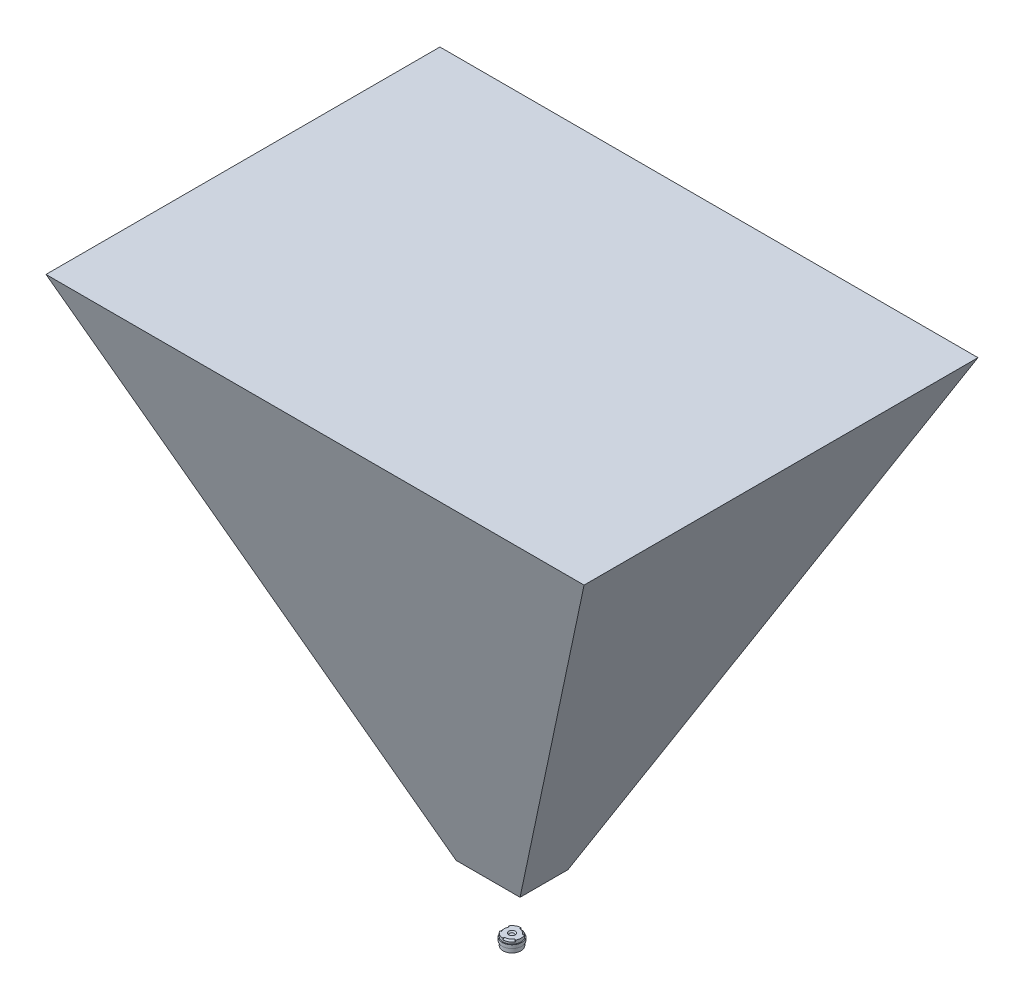
ISO-10303-21;
HEADER;
FILE_DESCRIPTION(('STEP AP214'),'2;1');
FILE_NAME('part.step','',(''),(''),'','','');
FILE_SCHEMA(('AUTOMOTIVE_DESIGN { 1 0 10303 214 1 1 1 1 }'));
ENDSEC;
DATA;
#1=APPLICATION_CONTEXT('core data for automotive mechanical design processes');
#2=APPLICATION_PROTOCOL_DEFINITION('international standard','automotive_design',2000,#1);
#3=PRODUCT_CONTEXT('',#1,'mechanical');
#4=PRODUCT('Part','Part','',(#3));
#5=PRODUCT_RELATED_PRODUCT_CATEGORY('part','',(#4));
#6=PRODUCT_DEFINITION_FORMATION('','',#4);
#7=PRODUCT_DEFINITION_CONTEXT('part definition',#1,'design');
#8=PRODUCT_DEFINITION('design','',#6,#7);
#9=PRODUCT_DEFINITION_SHAPE('','',#8);
#10=(LENGTH_UNIT() NAMED_UNIT(*) SI_UNIT(.MILLI.,.METRE.));
#11=(NAMED_UNIT(*) PLANE_ANGLE_UNIT() SI_UNIT($,.RADIAN.));
#12=(NAMED_UNIT(*) SI_UNIT($,.STERADIAN.) SOLID_ANGLE_UNIT());
#13=UNCERTAINTY_MEASURE_WITH_UNIT(LENGTH_MEASURE(1.E-05),#10,'distance_accuracy_value','');
#14=(GEOMETRIC_REPRESENTATION_CONTEXT(3) GLOBAL_UNCERTAINTY_ASSIGNED_CONTEXT((#13)) GLOBAL_UNIT_ASSIGNED_CONTEXT((#10,
#11,#12)) REPRESENTATION_CONTEXT('',''));
#15=CARTESIAN_POINT('',(0.,0.,0.));
#16=DIRECTION('',(0.,0.,1.));
#17=DIRECTION('',(1.,0.,0.));
#18=AXIS2_PLACEMENT_3D('',#15,#16,#17);
#19=CARTESIAN_POINT('',(100.,163.556471780119,60.));
#20=DIRECTION('',(0.,-1.,0.));
#21=DIRECTION('',(0.,0.,-1.));
#22=AXIS2_PLACEMENT_3D('',#19,#20,#21);
#23=PLANE('',#22);
#24=DIRECTION('',(0.,0.,1.));
#25=VECTOR('',#24,1.);
#26=CARTESIAN_POINT('',(-81.9593515242549,163.556471780119,-60.));
#27=LINE('',#26,#25);
#28=CARTESIAN_POINT('',(-81.9593515242549,163.556471780119,-60.));
#29=VERTEX_POINT('',#28);
#30=CARTESIAN_POINT('',(-81.9593515242549,163.556471780119,60.));
#31=VERTEX_POINT('',#30);
#32=EDGE_CURVE('E69',#29,#31,#27,.T.);
#33=ORIENTED_EDGE('',*,*,#32,.T.);
#34=DIRECTION('',(-1.,0.,0.));
#35=VECTOR('',#34,1.);
#36=CARTESIAN_POINT('',(100.,163.556471780119,60.));
#37=LINE('',#36,#35);
#38=CARTESIAN_POINT('',(81.9593515242549,163.556471780119,60.));
#39=VERTEX_POINT('',#38);
#40=EDGE_CURVE('E99',#39,#31,#37,.T.);
#41=ORIENTED_EDGE('',*,*,#40,.F.);
#42=DIRECTION('',(0.,0.,1.));
#43=VECTOR('',#42,1.);
#44=CARTESIAN_POINT('',(81.9593515242549,163.556471780119,-60.));
#45=LINE('',#44,#43);
#46=CARTESIAN_POINT('',(81.9593515242549,163.556471780119,-60.));
#47=VERTEX_POINT('',#46);
#48=EDGE_CURVE('E85',#47,#39,#45,.T.);
#49=ORIENTED_EDGE('',*,*,#48,.F.);
#50=DIRECTION('',(-1.,0.,0.));
#51=VECTOR('',#50,1.);
#52=CARTESIAN_POINT('',(100.,163.556471780119,-60.));
#53=LINE('',#52,#51);
#54=EDGE_CURVE('E111',#47,#29,#53,.T.);
#55=ORIENTED_EDGE('',*,*,#54,.T.);
#56=EDGE_LOOP('',(#33,#41,#49,#55));
#57=FACE_BOUND('',#56,.T.);
#58=ADVANCED_FACE('F48',(#57),#23,.F.);
#59=CARTESIAN_POINT('',(100.,18.7078266128409,7.27940468532404));
#60=DIRECTION('',(0.,0.342020143325668,-0.939692620785909));
#61=DIRECTION('',(0.,0.939692620785909,0.342020143325668));
#62=AXIS2_PLACEMENT_3D('',#59,#60,#61);
#63=PLANE('',#62);
#64=DIRECTION('',(-0.424258256279284,0.850930418263275,0.309713343679521));
#65=VECTOR('',#64,1.);
#66=CARTESIAN_POINT('',(10.0122642665054,-20.9100514633612,-7.14032367920101));
#67=LINE('',#66,#65);
#68=CARTESIAN_POINT('',(-9.7404810923923,18.7078266128409,7.27940468532404));
#69=VERTEX_POINT('',#68);
#70=EDGE_CURVE('E102',#69,#31,#67,.T.);
#71=ORIENTED_EDGE('',*,*,#70,.F.);
#72=DIRECTION('',(-1.,0.,0.));
#73=VECTOR('',#72,1.);
#74=CARTESIAN_POINT('',(100.,18.7078266128409,7.27940468532404));
#75=LINE('',#74,#73);
#76=CARTESIAN_POINT('',(9.7404810923923,18.7078266128409,7.27940468532404));
#77=VERTEX_POINT('',#76);
#78=EDGE_CURVE('E101',#77,#69,#75,.T.);
#79=ORIENTED_EDGE('',*,*,#78,.F.);
#80=DIRECTION('',(-0.424258256279284,-0.850930418263275,-0.309713343679521));
#81=VECTOR('',#80,1.);
#82=CARTESIAN_POINT('',(25.9867493377225,51.2927996301147,19.139364947979));
#83=LINE('',#82,#81);
#84=EDGE_CURVE('E88',#39,#77,#83,.T.);
#85=ORIENTED_EDGE('',*,*,#84,.F.);
#86=ORIENTED_EDGE('',*,*,#40,.T.);
#87=EDGE_LOOP('',(#71,#79,#85,#86));
#88=FACE_BOUND('',#87,.T.);
#89=ADVANCED_FACE('F98',(#88),#63,.F.);
#90=CARTESIAN_POINT('',(100.,18.7078266128409,7.27940468532404));
#91=DIRECTION('',(0.,1.,0.));
#92=DIRECTION('',(0.,0.,1.));
#93=AXIS2_PLACEMENT_3D('',#90,#91,#92);
#94=PLANE('',#93);
#95=DIRECTION('',(0.,0.,1.));
#96=VECTOR('',#95,1.);
#97=CARTESIAN_POINT('',(-9.7404810923923,18.7078266128409,-60.));
#98=LINE('',#97,#96);
#99=CARTESIAN_POINT('',(-9.7404810923923,18.7078266128408,-7.27940468532402));
#100=VERTEX_POINT('',#99);
#101=EDGE_CURVE('E103',#100,#69,#98,.T.);
#102=ORIENTED_EDGE('',*,*,#101,.F.);
#103=DIRECTION('',(-1.,0.,0.));
#104=VECTOR('',#103,1.);
#105=CARTESIAN_POINT('',(100.,18.7078266128409,-7.27940468532404));
#106=LINE('',#105,#104);
#107=CARTESIAN_POINT('',(9.74048109239231,18.7078266128409,-7.27940468532404));
#108=VERTEX_POINT('',#107);
#109=EDGE_CURVE('E106',#108,#100,#106,.T.);
#110=ORIENTED_EDGE('',*,*,#109,.F.);
#111=DIRECTION('',(0.,0.,1.));
#112=VECTOR('',#111,1.);
#113=CARTESIAN_POINT('',(9.7404810923923,18.7078266128409,-60.));
#114=LINE('',#113,#112);
#115=EDGE_CURVE('E62',#108,#77,#114,.T.);
#116=ORIENTED_EDGE('',*,*,#115,.T.);
#117=ORIENTED_EDGE('',*,*,#78,.T.);
#118=EDGE_LOOP('',(#102,#110,#116,#117));
#119=FACE_BOUND('',#118,.T.);
#120=ADVANCED_FACE('F120',(#119),#94,.F.);
#121=CARTESIAN_POINT('',(100.,18.7078266128409,-7.27940468532404));
#122=DIRECTION('',(0.,0.342020143325668,0.939692620785909));
#123=DIRECTION('',(0.,-0.939692620785909,0.342020143325668));
#124=AXIS2_PLACEMENT_3D('',#121,#122,#123);
#125=PLANE('',#124);
#126=DIRECTION('',(0.424258256279284,-0.850930418263275,0.309713343679521));
#127=VECTOR('',#126,1.);
#128=CARTESIAN_POINT('',(10.0122642665054,-20.9100514633612,7.14032367920101));
#129=LINE('',#128,#127);
#130=EDGE_CURVE('E13',#29,#100,#129,.T.);
#131=ORIENTED_EDGE('',*,*,#130,.F.);
#132=ORIENTED_EDGE('',*,*,#54,.F.);
#133=DIRECTION('',(0.424258256279284,0.850930418263275,-0.309713343679521));
#134=VECTOR('',#133,1.);
#135=CARTESIAN_POINT('',(25.9867493377225,51.2927996301147,-19.139364947979));
#136=LINE('',#135,#134);
#137=EDGE_CURVE('E55',#108,#47,#136,.T.);
#138=ORIENTED_EDGE('',*,*,#137,.F.);
#139=ORIENTED_EDGE('',*,*,#109,.T.);
#140=EDGE_LOOP('',(#131,#132,#138,#139));
#141=FACE_BOUND('',#140,.T.);
#142=ADVANCED_FACE('F122',(#141),#125,.F.);
#143=CARTESIAN_POINT('',(9.7404810923923,18.7078266128409,-60.));
#144=DIRECTION('',(0.894934361602024,-0.44619781310981,0.));
#145=DIRECTION('',(0.44619781310981,0.894934361602024,0.));
#146=AXIS2_PLACEMENT_3D('',#143,#144,#145);
#147=PLANE('',#146);
#148=ORIENTED_EDGE('',*,*,#84,.T.);
#149=ORIENTED_EDGE('',*,*,#115,.F.);
#150=ORIENTED_EDGE('',*,*,#137,.T.);
#151=ORIENTED_EDGE('',*,*,#48,.T.);
#152=EDGE_LOOP('',(#148,#149,#150,#151));
#153=FACE_BOUND('',#152,.T.);
#154=ADVANCED_FACE('F87',(#153),#147,.T.);
#155=CARTESIAN_POINT('',(-9.7404810923923,18.7078266128409,-60.));
#156=DIRECTION('',(-0.894934361602024,-0.44619781310981,0.));
#157=DIRECTION('',(0.44619781310981,-0.894934361602024,0.));
#158=AXIS2_PLACEMENT_3D('',#155,#156,#157);
#159=PLANE('',#158);
#160=ORIENTED_EDGE('',*,*,#70,.T.);
#161=ORIENTED_EDGE('',*,*,#32,.F.);
#162=ORIENTED_EDGE('',*,*,#130,.T.);
#163=ORIENTED_EDGE('',*,*,#101,.T.);
#164=EDGE_LOOP('',(#160,#161,#162,#163));
#165=FACE_BOUND('',#164,.T.);
#166=ADVANCED_FACE('F117',(#165),#159,.T.);
#167=CLOSED_SHELL('',(#58,#89,#120,#142,#154,#166));
#168=MANIFOLD_SOLID_BREP('B2',#167);
#169=CARTESIAN_POINT('',(1.,0.8,0.));
#170=DIRECTION('',(0.,-1.,0.));
#171=DIRECTION('',(0.,0.,-1.));
#172=AXIS2_PLACEMENT_3D('',#169,#170,#171);
#173=PLANE('',#172);
#174=CARTESIAN_POINT('',(0.,0.8,0.));
#175=DIRECTION('',(0.,1.,0.));
#176=DIRECTION('',(0.,0.,1.));
#177=AXIS2_PLACEMENT_3D('',#174,#175,#176);
#178=CIRCLE('',#177,1.);
#179=CARTESIAN_POINT('',(0.,0.8,1.));
#180=VERTEX_POINT('',#179);
#181=EDGE_CURVE('E46',#180,#180,#178,.T.);
#182=ORIENTED_EDGE('',*,*,#181,.F.);
#183=EDGE_LOOP('',(#182));
#184=FACE_BOUND('',#183,.T.);
#185=DIRECTION('',(0.,0.,-1.));
#186=VECTOR('',#185,1.);
#187=CARTESIAN_POINT('',(0.,0.8,2.3));
#188=LINE('',#187,#186);
#189=CARTESIAN_POINT('',(0.,0.8,2.75));
#190=VERTEX_POINT('',#189);
#191=CARTESIAN_POINT('',(0.,0.8,2.3));
#192=VERTEX_POINT('',#191);
#193=EDGE_CURVE('E258',#190,#192,#188,.T.);
#194=ORIENTED_EDGE('',*,*,#193,.T.);
#195=CARTESIAN_POINT('',(0.,0.8,0.));
#196=DIRECTION('',(0.,1.,0.));
#197=DIRECTION('',(-0.866025403784443,0.,-0.499999999999992));
#198=AXIS2_PLACEMENT_3D('',#195,#196,#197);
#199=CIRCLE('',#198,2.3);
#200=CARTESIAN_POINT('',(1.99185842870422,0.8,1.14999999999998));
#201=VERTEX_POINT('',#200);
#202=EDGE_CURVE('E243',#192,#201,#199,.T.);
#203=ORIENTED_EDGE('',*,*,#202,.T.);
#204=DIRECTION('',(-0.866025403784443,0.,-0.499999999999992));
#205=VECTOR('',#204,1.);
#206=CARTESIAN_POINT('',(1.99185842870422,0.8,1.14999999999998));
#207=LINE('',#206,#205);
#208=CARTESIAN_POINT('',(2.38156986040722,0.8,1.37499999999998));
#209=VERTEX_POINT('',#208);
#210=EDGE_CURVE('E249',#209,#201,#207,.T.);
#211=ORIENTED_EDGE('',*,*,#210,.F.);
#212=CARTESIAN_POINT('',(0.,0.8,0.));
#213=DIRECTION('',(0.,1.,0.));
#214=DIRECTION('',(0.,0.,1.));
#215=AXIS2_PLACEMENT_3D('',#212,#213,#214);
#216=CIRCLE('',#215,2.75);
#217=CARTESIAN_POINT('',(2.38156986040721,0.8,-1.37499999999999));
#218=VERTEX_POINT('',#217);
#219=EDGE_CURVE('E329',#209,#218,#216,.T.);
#220=ORIENTED_EDGE('',*,*,#219,.T.);
#221=DIRECTION('',(-0.86602540378444,0.,0.499999999999998));
#222=VECTOR('',#221,1.);
#223=CARTESIAN_POINT('',(1.99185842870421,0.8,-1.15));
#224=LINE('',#223,#222);
#225=CARTESIAN_POINT('',(1.99185842870421,0.8,-1.15));
#226=VERTEX_POINT('',#225);
#227=EDGE_CURVE('E292',#218,#226,#224,.T.);
#228=ORIENTED_EDGE('',*,*,#227,.T.);
#229=CARTESIAN_POINT('',(0.,0.8,0.));
#230=DIRECTION('',(0.,1.,0.));
#231=DIRECTION('',(0.,0.,1.));
#232=AXIS2_PLACEMENT_3D('',#229,#230,#231);
#233=CIRCLE('',#232,2.3);
#234=CARTESIAN_POINT('',(0.,0.8,-2.3));
#235=VERTEX_POINT('',#234);
#236=EDGE_CURVE('E300',#226,#235,#233,.T.);
#237=ORIENTED_EDGE('',*,*,#236,.T.);
#238=DIRECTION('',(0.,0.,1.));
#239=VECTOR('',#238,1.);
#240=CARTESIAN_POINT('',(0.,0.8,-2.3));
#241=LINE('',#240,#239);
#242=CARTESIAN_POINT('',(0.,0.8,-2.75));
#243=VERTEX_POINT('',#242);
#244=EDGE_CURVE('E285',#243,#235,#241,.T.);
#245=ORIENTED_EDGE('',*,*,#244,.F.);
#246=CARTESIAN_POINT('',(-2.38156986040721,0.8,-1.37499999999999));
#247=VERTEX_POINT('',#246);
#248=EDGE_CURVE('E180',#243,#247,#216,.T.);
#249=ORIENTED_EDGE('',*,*,#248,.T.);
#250=DIRECTION('',(0.86602540378444,0.,0.499999999999998));
#251=VECTOR('',#250,1.);
#252=CARTESIAN_POINT('',(-1.99185842870421,0.8,-1.15));
#253=LINE('',#252,#251);
#254=CARTESIAN_POINT('',(-1.99185842870421,0.8,-1.15));
#255=VERTEX_POINT('',#254);
#256=EDGE_CURVE('E272',#247,#255,#253,.T.);
#257=ORIENTED_EDGE('',*,*,#256,.T.);
#258=CARTESIAN_POINT('',(0.,0.8,0.));
#259=DIRECTION('',(0.,1.,0.));
#260=DIRECTION('',(0.866025403784436,0.,-0.500000000000004));
#261=AXIS2_PLACEMENT_3D('',#258,#259,#260);
#262=CIRCLE('',#261,2.3);
#263=CARTESIAN_POINT('',(-1.9918584287042,0.8,1.15000000000001));
#264=VERTEX_POINT('',#263);
#265=EDGE_CURVE('E280',#255,#264,#262,.T.);
#266=ORIENTED_EDGE('',*,*,#265,.T.);
#267=DIRECTION('',(0.866025403784436,0.,-0.500000000000004));
#268=VECTOR('',#267,1.);
#269=CARTESIAN_POINT('',(-1.9918584287042,0.8,1.15000000000001));
#270=LINE('',#269,#268);
#271=CARTESIAN_POINT('',(-2.3815698604072,0.8,1.37500000000001));
#272=VERTEX_POINT('',#271);
#273=EDGE_CURVE('E261',#272,#264,#270,.T.);
#274=ORIENTED_EDGE('',*,*,#273,.F.);
#275=EDGE_CURVE('E331',#272,#190,#216,.T.);
#276=ORIENTED_EDGE('',*,*,#275,.T.);
#277=EDGE_LOOP('',(#194,#203,#211,#220,#228,#237,#245,#249,#257,#266,#274,#276));
#278=FACE_BOUND('',#277,.T.);
#279=ADVANCED_FACE('F172',(#184,#278),#173,.F.);
#280=CARTESIAN_POINT('',(0.,0.,0.));
#281=DIRECTION('',(0.,1.,0.));
#282=DIRECTION('',(0.,0.,1.));
#283=AXIS2_PLACEMENT_3D('',#280,#281,#282);
#284=CYLINDRICAL_SURFACE('',#283,2.75);
#285=CARTESIAN_POINT('',(0.,-0.2,0.));
#286=DIRECTION('',(0.,-1.,0.));
#287=DIRECTION('',(0.,0.,-1.));
#288=AXIS2_PLACEMENT_3D('',#285,#286,#287);
#289=CIRCLE('',#288,2.75);
#290=CARTESIAN_POINT('',(0.,-0.2,-2.75));
#291=VERTEX_POINT('',#290);
#292=EDGE_CURVE('E306',#291,#291,#289,.T.);
#293=ORIENTED_EDGE('',*,*,#292,.F.);
#294=EDGE_LOOP('',(#293));
#295=FACE_BOUND('',#294,.T.);
#296=DIRECTION('',(0.,1.,0.));
#297=VECTOR('',#296,1.);
#298=CARTESIAN_POINT('',(0.,0.8,2.75));
#299=LINE('',#298,#297);
#300=CARTESIAN_POINT('',(0.,0.349999999999999,2.75));
#301=VERTEX_POINT('',#300);
#302=EDGE_CURVE('E259',#301,#190,#299,.T.);
#303=ORIENTED_EDGE('',*,*,#302,.T.);
#304=ORIENTED_EDGE('',*,*,#275,.F.);
#305=DIRECTION('',(0.,1.,0.));
#306=VECTOR('',#305,1.);
#307=CARTESIAN_POINT('',(-2.3815698604072,0.8,1.37500000000001));
#308=LINE('',#307,#306);
#309=CARTESIAN_POINT('',(-2.3815698604072,0.349999999999999,1.37500000000001));
#310=VERTEX_POINT('',#309);
#311=EDGE_CURVE('E270',#310,#272,#308,.T.);
#312=ORIENTED_EDGE('',*,*,#311,.F.);
#313=CARTESIAN_POINT('',(0.,0.349999999999999,0.));
#314=DIRECTION('',(0.,1.,0.));
#315=DIRECTION('',(0.866025403784436,0.,-0.500000000000004));
#316=AXIS2_PLACEMENT_3D('',#313,#314,#315);
#317=CIRCLE('',#316,2.75);
#318=CARTESIAN_POINT('',(-2.38156986040721,0.349999999999999,-1.37499999999999));
#319=VERTEX_POINT('',#318);
#320=EDGE_CURVE('E283',#319,#310,#317,.T.);
#321=ORIENTED_EDGE('',*,*,#320,.F.);
#322=DIRECTION('',(0.,1.,0.));
#323=VECTOR('',#322,1.);
#324=CARTESIAN_POINT('',(-2.38156986040721,0.8,-1.37499999999999));
#325=LINE('',#324,#323);
#326=EDGE_CURVE('E277',#319,#247,#325,.T.);
#327=ORIENTED_EDGE('',*,*,#326,.T.);
#328=ORIENTED_EDGE('',*,*,#248,.F.);
#329=DIRECTION('',(0.,1.,0.));
#330=VECTOR('',#329,1.);
#331=CARTESIAN_POINT('',(0.,0.8,-2.75));
#332=LINE('',#331,#330);
#333=CARTESIAN_POINT('',(0.,0.349999999999999,-2.75));
#334=VERTEX_POINT('',#333);
#335=EDGE_CURVE('E290',#334,#243,#332,.T.);
#336=ORIENTED_EDGE('',*,*,#335,.F.);
#337=CARTESIAN_POINT('',(0.,0.349999999999999,0.));
#338=DIRECTION('',(0.,1.,0.));
#339=DIRECTION('',(0.,0.,1.));
#340=AXIS2_PLACEMENT_3D('',#337,#338,#339);
#341=CIRCLE('',#340,2.75);
#342=CARTESIAN_POINT('',(2.38156986040721,0.349999999999999,-1.37499999999999));
#343=VERTEX_POINT('',#342);
#344=EDGE_CURVE('E303',#343,#334,#341,.T.);
#345=ORIENTED_EDGE('',*,*,#344,.F.);
#346=DIRECTION('',(0.,1.,0.));
#347=VECTOR('',#346,1.);
#348=CARTESIAN_POINT('',(2.38156986040721,0.8,-1.37499999999999));
#349=LINE('',#348,#347);
#350=EDGE_CURVE('E297',#343,#218,#349,.T.);
#351=ORIENTED_EDGE('',*,*,#350,.T.);
#352=ORIENTED_EDGE('',*,*,#219,.F.);
#353=DIRECTION('',(0.,1.,0.));
#354=VECTOR('',#353,1.);
#355=CARTESIAN_POINT('',(2.38156986040722,0.8,1.37499999999998));
#356=LINE('',#355,#354);
#357=CARTESIAN_POINT('',(2.38156986040722,0.349999999999999,1.37499999999998));
#358=VERTEX_POINT('',#357);
#359=EDGE_CURVE('E248',#358,#209,#356,.T.);
#360=ORIENTED_EDGE('',*,*,#359,.F.);
#361=CARTESIAN_POINT('',(0.,0.349999999999999,0.));
#362=DIRECTION('',(0.,1.,0.));
#363=DIRECTION('',(-0.866025403784443,0.,-0.499999999999992));
#364=AXIS2_PLACEMENT_3D('',#361,#362,#363);
#365=CIRCLE('',#364,2.75);
#366=EDGE_CURVE('E246',#301,#358,#365,.T.);
#367=ORIENTED_EDGE('',*,*,#366,.F.);
#368=EDGE_LOOP('',(#303,#304,#312,#321,#327,#328,#336,#345,#351,#352,#360,#367));
#369=FACE_BOUND('',#368,.T.);
#370=ADVANCED_FACE('F341',(#295,#369),#284,.T.);
#371=CARTESIAN_POINT('',(0.,-1.2,0.));
#372=DIRECTION('',(0.,-1.,0.));
#373=DIRECTION('',(0.,0.,-1.));
#374=AXIS2_PLACEMENT_3D('',#371,#372,#373);
#375=CIRCLE('',#374,2.75);
#376=CARTESIAN_POINT('',(0.,-1.2,-2.75));
#377=VERTEX_POINT('',#376);
#378=EDGE_CURVE('E315',#377,#377,#375,.T.);
#379=ORIENTED_EDGE('',*,*,#378,.T.);
#380=EDGE_LOOP('',(#379));
#381=FACE_BOUND('',#380,.T.);
#382=CARTESIAN_POINT('',(0.,-2.55,0.));
#383=DIRECTION('',(0.,1.,0.));
#384=DIRECTION('',(0.,0.,1.));
#385=AXIS2_PLACEMENT_3D('',#382,#383,#384);
#386=CIRCLE('',#385,2.75);
#387=CARTESIAN_POINT('',(0.,-2.55,2.75));
#388=VERTEX_POINT('',#387);
#389=EDGE_CURVE('E327',#388,#388,#386,.T.);
#390=ORIENTED_EDGE('',*,*,#389,.T.);
#391=EDGE_LOOP('',(#390));
#392=FACE_BOUND('',#391,.T.);
#393=ADVANCED_FACE('F375',(#381,#392),#284,.T.);
#394=CARTESIAN_POINT('',(2.75,-2.55,0.));
#395=DIRECTION('',(0.,1.,0.));
#396=DIRECTION('',(0.,0.,1.));
#397=AXIS2_PLACEMENT_3D('',#394,#395,#396);
#398=PLANE('',#397);
#399=ORIENTED_EDGE('',*,*,#389,.F.);
#400=EDGE_LOOP('',(#399));
#401=FACE_BOUND('',#400,.T.);
#402=CARTESIAN_POINT('',(0.,-2.55,0.));
#403=DIRECTION('',(0.,1.,0.));
#404=DIRECTION('',(0.,0.,1.));
#405=AXIS2_PLACEMENT_3D('',#402,#403,#404);
#406=CIRCLE('',#405,2.1);
#407=CARTESIAN_POINT('',(0.,-2.55,2.1));
#408=VERTEX_POINT('',#407);
#409=EDGE_CURVE('E324',#408,#408,#406,.T.);
#410=ORIENTED_EDGE('',*,*,#409,.T.);
#411=EDGE_LOOP('',(#410));
#412=FACE_BOUND('',#411,.T.);
#413=ADVANCED_FACE('F380',(#401,#412),#398,.F.);
#414=CARTESIAN_POINT('',(0.,-2.25,0.));
#415=DIRECTION('',(0.,-1.,0.));
#416=DIRECTION('',(0.,0.,-1.));
#417=AXIS2_PLACEMENT_3D('',#414,#415,#416);
#418=CONICAL_SURFACE('',#417,1.8,0.78539816339745);
#419=ORIENTED_EDGE('',*,*,#409,.F.);
#420=EDGE_LOOP('',(#419));
#421=FACE_BOUND('',#420,.T.);
#422=CARTESIAN_POINT('',(0.,-2.25,0.));
#423=DIRECTION('',(0.,1.,0.));
#424=DIRECTION('',(0.,0.,1.));
#425=AXIS2_PLACEMENT_3D('',#422,#423,#424);
#426=CIRCLE('',#425,1.8);
#427=CARTESIAN_POINT('',(0.,-2.25,1.8));
#428=VERTEX_POINT('',#427);
#429=EDGE_CURVE('E321',#428,#428,#426,.T.);
#430=ORIENTED_EDGE('',*,*,#429,.T.);
#431=EDGE_LOOP('',(#430));
#432=FACE_BOUND('',#431,.T.);
#433=ADVANCED_FACE('F383',(#421,#432),#418,.F.);
#434=CARTESIAN_POINT('',(0.,3.,0.));
#435=DIRECTION('',(0.,1.,0.));
#436=DIRECTION('',(1.,0.,0.));
#437=AXIS2_PLACEMENT_3D('',#434,#435,#436);
#438=SPHERICAL_SURFACE('',#437,5.55);
#439=ORIENTED_EDGE('',*,*,#429,.F.);
#440=EDGE_LOOP('',(#439));
#441=FACE_BOUND('',#440,.T.);
#442=ADVANCED_FACE('F387',(#441),#438,.T.);
#443=CARTESIAN_POINT('',(2.75,-1.2,0.));
#444=DIRECTION('',(0.,-1.,0.));
#445=DIRECTION('',(0.,0.,-1.));
#446=AXIS2_PLACEMENT_3D('',#443,#444,#445);
#447=PLANE('',#446);
#448=CARTESIAN_POINT('',(0.,-1.2,0.));
#449=DIRECTION('',(0.,-1.,0.));
#450=DIRECTION('',(0.,0.,-1.));
#451=AXIS2_PLACEMENT_3D('',#448,#449,#450);
#452=CIRCLE('',#451,3.);
#453=CARTESIAN_POINT('',(0.,-1.2,-3.));
#454=VERTEX_POINT('',#453);
#455=EDGE_CURVE('E312',#454,#454,#452,.T.);
#456=ORIENTED_EDGE('',*,*,#455,.T.);
#457=EDGE_LOOP('',(#456));
#458=FACE_BOUND('',#457,.T.);
#459=ORIENTED_EDGE('',*,*,#378,.F.);
#460=EDGE_LOOP('',(#459));
#461=FACE_BOUND('',#460,.T.);
#462=ADVANCED_FACE('F391',(#458,#461),#447,.T.);
#463=CARTESIAN_POINT('',(0.,0.,0.));
#464=DIRECTION('',(0.,-1.,0.));
#465=DIRECTION('',(0.,0.,-1.));
#466=AXIS2_PLACEMENT_3D('',#463,#464,#465);
#467=CYLINDRICAL_SURFACE('',#466,3.);
#468=CARTESIAN_POINT('',(0.,-0.2,0.));
#469=DIRECTION('',(0.,-1.,0.));
#470=DIRECTION('',(0.,0.,-1.));
#471=AXIS2_PLACEMENT_3D('',#468,#469,#470);
#472=CIRCLE('',#471,3.);
#473=CARTESIAN_POINT('',(0.,-0.2,-3.));
#474=VERTEX_POINT('',#473);
#475=EDGE_CURVE('E309',#474,#474,#472,.T.);
#476=ORIENTED_EDGE('',*,*,#475,.T.);
#477=EDGE_LOOP('',(#476));
#478=FACE_BOUND('',#477,.T.);
#479=ORIENTED_EDGE('',*,*,#455,.F.);
#480=EDGE_LOOP('',(#479));
#481=FACE_BOUND('',#480,.T.);
#482=ADVANCED_FACE('F400',(#478,#481),#467,.T.);
#483=CARTESIAN_POINT('',(2.75,-0.2,0.));
#484=DIRECTION('',(0.,1.,0.));
#485=DIRECTION('',(0.,0.,1.));
#486=AXIS2_PLACEMENT_3D('',#483,#484,#485);
#487=PLANE('',#486);
#488=ORIENTED_EDGE('',*,*,#292,.T.);
#489=EDGE_LOOP('',(#488));
#490=FACE_BOUND('',#489,.T.);
#491=ORIENTED_EDGE('',*,*,#475,.F.);
#492=EDGE_LOOP('',(#491));
#493=FACE_BOUND('',#492,.T.);
#494=ADVANCED_FACE('F396',(#490,#493),#487,.T.);
#495=CARTESIAN_POINT('',(0.,-1.478125,0.));
#496=DIRECTION('',(0.,1.,0.));
#497=DIRECTION('',(1.,0.,0.));
#498=AXIS2_PLACEMENT_3D('',#495,#496,#497);
#499=SPHERICAL_SURFACE('',#498,2.003125);
#500=CARTESIAN_POINT('',(0.,0.425,0.));
#501=DIRECTION('',(0.,1.,0.));
#502=DIRECTION('',(0.,0.,1.));
#503=AXIS2_PLACEMENT_3D('',#500,#501,#502);
#504=CIRCLE('',#503,0.625);
#505=CARTESIAN_POINT('',(0.,0.425,0.625));
#506=VERTEX_POINT('',#505);
#507=EDGE_CURVE('E318',#506,#506,#504,.T.);
#508=ORIENTED_EDGE('',*,*,#507,.T.);
#509=EDGE_LOOP('',(#508));
#510=FACE_BOUND('',#509,.T.);
#511=ADVANCED_FACE('F393',(#510),#499,.T.);
#512=CARTESIAN_POINT('',(0.,0.8,0.));
#513=DIRECTION('',(0.,1.,0.));
#514=DIRECTION('',(0.,0.,1.));
#515=AXIS2_PLACEMENT_3D('',#512,#513,#514);
#516=CONICAL_SURFACE('',#515,1.,0.785398163397449);
#517=ORIENTED_EDGE('',*,*,#507,.F.);
#518=EDGE_LOOP('',(#517));
#519=FACE_BOUND('',#518,.T.);
#520=ORIENTED_EDGE('',*,*,#181,.T.);
#521=EDGE_LOOP('',(#520));
#522=FACE_BOUND('',#521,.T.);
#523=ADVANCED_FACE('F174',(#519,#522),#516,.F.);
#524=CARTESIAN_POINT('',(0.,0.8,0.));
#525=DIRECTION('',(0.,-1.,0.));
#526=DIRECTION('',(0.,0.,-1.));
#527=AXIS2_PLACEMENT_3D('',#524,#525,#526);
#528=CONICAL_SURFACE('',#527,2.3,0.785398163397448);
#529=DIRECTION('',(0.612372435695795,-0.707106781186547,-0.353553390593272));
#530=VECTOR('',#529,1.);
#531=CARTESIAN_POINT('',(2.38156986040721,0.349999999999999,-1.37499999999999));
#532=LINE('',#531,#530);
#533=EDGE_CURVE('E295',#226,#343,#532,.T.);
#534=ORIENTED_EDGE('',*,*,#533,.T.);
#535=ORIENTED_EDGE('',*,*,#344,.T.);
#536=DIRECTION('',(0.,-0.707106781186547,-0.707106781186547));
#537=VECTOR('',#536,1.);
#538=CARTESIAN_POINT('',(0.,0.349999999999999,-2.75));
#539=LINE('',#538,#537);
#540=EDGE_CURVE('E288',#235,#334,#539,.T.);
#541=ORIENTED_EDGE('',*,*,#540,.F.);
#542=ORIENTED_EDGE('',*,*,#236,.F.);
#543=EDGE_LOOP('',(#534,#535,#541,#542));
#544=FACE_BOUND('',#543,.T.);
#545=ADVANCED_FACE('F344',(#544),#528,.T.);
#546=CARTESIAN_POINT('',(0.,0.,0.));
#547=DIRECTION('',(-0.499999999999998,0.,-0.86602540378444));
#548=DIRECTION('',(-0.86602540378444,0.,0.499999999999998));
#549=AXIS2_PLACEMENT_3D('',#546,#547,#548);
#550=PLANE('',#549);
#551=ORIENTED_EDGE('',*,*,#227,.F.);
#552=ORIENTED_EDGE('',*,*,#350,.F.);
#553=ORIENTED_EDGE('',*,*,#533,.F.);
#554=EDGE_LOOP('',(#551,#552,#553));
#555=FACE_BOUND('',#554,.T.);
#556=ADVANCED_FACE('F339',(#555),#550,.T.);
#557=CARTESIAN_POINT('',(0.,0.,0.));
#558=DIRECTION('',(-1.,0.,0.));
#559=DIRECTION('',(0.,0.,1.));
#560=AXIS2_PLACEMENT_3D('',#557,#558,#559);
#561=PLANE('',#560);
#562=ORIENTED_EDGE('',*,*,#244,.T.);
#563=ORIENTED_EDGE('',*,*,#540,.T.);
#564=ORIENTED_EDGE('',*,*,#335,.T.);
#565=EDGE_LOOP('',(#562,#563,#564));
#566=FACE_BOUND('',#565,.T.);
#567=ADVANCED_FACE('F412',(#566),#561,.F.);
#568=CARTESIAN_POINT('',(0.,0.8,0.));
#569=DIRECTION('',(0.,-1.,0.));
#570=DIRECTION('',(-0.866025403784436,0.,0.500000000000004));
#571=AXIS2_PLACEMENT_3D('',#568,#569,#570);
#572=CONICAL_SURFACE('',#571,2.3,0.785398163397448);
#573=DIRECTION('',(-0.612372435695795,-0.707106781186547,-0.353553390593272));
#574=VECTOR('',#573,1.);
#575=CARTESIAN_POINT('',(-2.38156986040721,0.349999999999999,-1.37499999999999));
#576=LINE('',#575,#574);
#577=EDGE_CURVE('E275',#255,#319,#576,.T.);
#578=ORIENTED_EDGE('',*,*,#577,.T.);
#579=ORIENTED_EDGE('',*,*,#320,.T.);
#580=DIRECTION('',(-0.612372435695793,-0.707106781186547,0.353553390593277));
#581=VECTOR('',#580,1.);
#582=CARTESIAN_POINT('',(-2.3815698604072,0.349999999999999,1.37500000000001));
#583=LINE('',#582,#581);
#584=EDGE_CURVE('E195',#264,#310,#583,.T.);
#585=ORIENTED_EDGE('',*,*,#584,.F.);
#586=ORIENTED_EDGE('',*,*,#265,.F.);
#587=EDGE_LOOP('',(#578,#579,#585,#586));
#588=FACE_BOUND('',#587,.T.);
#589=ADVANCED_FACE('F355',(#588),#572,.T.);
#590=CARTESIAN_POINT('',(0.,0.,0.));
#591=DIRECTION('',(-0.499999999999998,0.,0.86602540378444));
#592=DIRECTION('',(0.86602540378444,0.,0.499999999999998));
#593=AXIS2_PLACEMENT_3D('',#590,#591,#592);
#594=PLANE('',#593);
#595=ORIENTED_EDGE('',*,*,#256,.F.);
#596=ORIENTED_EDGE('',*,*,#326,.F.);
#597=ORIENTED_EDGE('',*,*,#577,.F.);
#598=EDGE_LOOP('',(#595,#596,#597));
#599=FACE_BOUND('',#598,.T.);
#600=ADVANCED_FACE('F351',(#599),#594,.T.);
#601=CARTESIAN_POINT('',(0.,0.,0.));
#602=DIRECTION('',(0.500000000000004,0.,0.866025403784436));
#603=DIRECTION('',(0.866025403784436,0.,-0.500000000000004));
#604=AXIS2_PLACEMENT_3D('',#601,#602,#603);
#605=PLANE('',#604);
#606=ORIENTED_EDGE('',*,*,#273,.T.);
#607=ORIENTED_EDGE('',*,*,#584,.T.);
#608=ORIENTED_EDGE('',*,*,#311,.T.);
#609=EDGE_LOOP('',(#606,#607,#608));
#610=FACE_BOUND('',#609,.T.);
#611=ADVANCED_FACE('F356',(#610),#605,.F.);
#612=CARTESIAN_POINT('',(0.,0.8,0.));
#613=DIRECTION('',(0.,-1.,0.));
#614=DIRECTION('',(0.866025403784443,0.,0.499999999999992));
#615=AXIS2_PLACEMENT_3D('',#612,#613,#614);
#616=CONICAL_SURFACE('',#615,2.3,0.785398163397448);
#617=DIRECTION('',(0.,-0.707106781186547,0.707106781186547));
#618=VECTOR('',#617,1.);
#619=CARTESIAN_POINT('',(0.,0.349999999999999,2.75));
#620=LINE('',#619,#618);
#621=EDGE_CURVE('E264',#192,#301,#620,.T.);
#622=ORIENTED_EDGE('',*,*,#621,.T.);
#623=ORIENTED_EDGE('',*,*,#366,.T.);
#624=DIRECTION('',(0.612372435695798,-0.707106781186547,0.353553390593268));
#625=VECTOR('',#624,1.);
#626=CARTESIAN_POINT('',(2.38156986040722,0.349999999999999,1.37499999999998));
#627=LINE('',#626,#625);
#628=EDGE_CURVE('E187',#201,#358,#627,.T.);
#629=ORIENTED_EDGE('',*,*,#628,.F.);
#630=ORIENTED_EDGE('',*,*,#202,.F.);
#631=EDGE_LOOP('',(#622,#623,#629,#630));
#632=FACE_BOUND('',#631,.T.);
#633=ADVANCED_FACE('F241',(#632),#616,.T.);
#634=CARTESIAN_POINT('',(0.,0.,0.));
#635=DIRECTION('',(1.,0.,0.));
#636=DIRECTION('',(0.,0.,-1.));
#637=AXIS2_PLACEMENT_3D('',#634,#635,#636);
#638=PLANE('',#637);
#639=ORIENTED_EDGE('',*,*,#193,.F.);
#640=ORIENTED_EDGE('',*,*,#302,.F.);
#641=ORIENTED_EDGE('',*,*,#621,.F.);
#642=EDGE_LOOP('',(#639,#640,#641));
#643=FACE_BOUND('',#642,.T.);
#644=ADVANCED_FACE('F359',(#643),#638,.T.);
#645=CARTESIAN_POINT('',(0.,0.,0.));
#646=DIRECTION('',(0.499999999999992,0.,-0.866025403784443));
#647=DIRECTION('',(-0.866025403784443,0.,-0.499999999999992));
#648=AXIS2_PLACEMENT_3D('',#645,#646,#647);
#649=PLANE('',#648);
#650=ORIENTED_EDGE('',*,*,#210,.T.);
#651=ORIENTED_EDGE('',*,*,#628,.T.);
#652=ORIENTED_EDGE('',*,*,#359,.T.);
#653=EDGE_LOOP('',(#650,#651,#652));
#654=FACE_BOUND('',#653,.T.);
#655=ADVANCED_FACE('F252',(#654),#649,.F.);
#656=CLOSED_SHELL('',(#279,#370,#393,#413,#433,#442,#462,#482,#494,#511,#523,#545,#556,#567,
#589,#600,#611,#633,#644,#655));
#657=MANIFOLD_SOLID_BREP('B7',#656);
#658=ADVANCED_BREP_SHAPE_REPRESENTATION('',(#18,#168,#657),#14);
#659=SHAPE_DEFINITION_REPRESENTATION(#9,#658);
ENDSEC;
END-ISO-10303-21;
